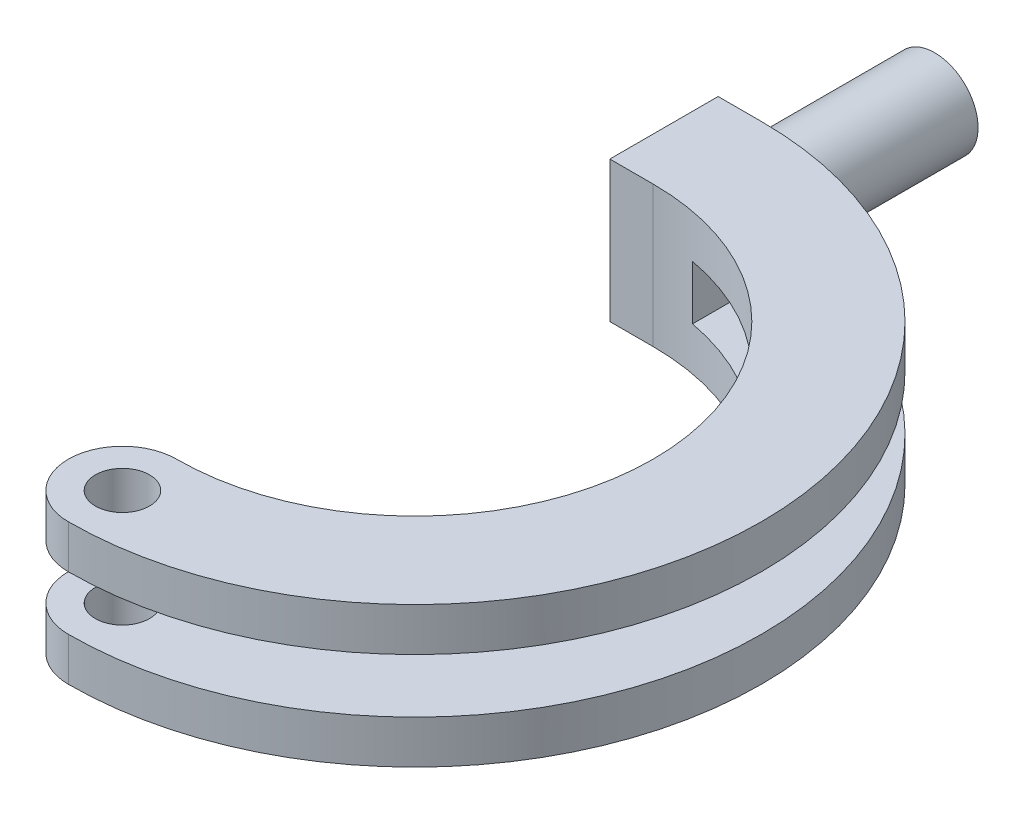
ISO-10303-21;
HEADER;
FILE_DESCRIPTION(('STEP AP214'),'2;1');
FILE_NAME('part.step','',(''),(''),'','','');
FILE_SCHEMA(('AUTOMOTIVE_DESIGN { 1 0 10303 214 1 1 1 1 }'));
ENDSEC;
DATA;
#1=APPLICATION_CONTEXT('core data for automotive mechanical design processes');
#2=APPLICATION_PROTOCOL_DEFINITION('international standard','automotive_design',2000,#1);
#3=PRODUCT_CONTEXT('',#1,'mechanical');
#4=PRODUCT('Part','Part','',(#3));
#5=PRODUCT_RELATED_PRODUCT_CATEGORY('part','',(#4));
#6=PRODUCT_DEFINITION_FORMATION('','',#4);
#7=PRODUCT_DEFINITION_CONTEXT('part definition',#1,'design');
#8=PRODUCT_DEFINITION('design','',#6,#7);
#9=PRODUCT_DEFINITION_SHAPE('','',#8);
#10=(LENGTH_UNIT() NAMED_UNIT(*) SI_UNIT(.MILLI.,.METRE.));
#11=(NAMED_UNIT(*) PLANE_ANGLE_UNIT() SI_UNIT($,.RADIAN.));
#12=(NAMED_UNIT(*) SI_UNIT($,.STERADIAN.) SOLID_ANGLE_UNIT());
#13=UNCERTAINTY_MEASURE_WITH_UNIT(LENGTH_MEASURE(1.E-05),#10,'distance_accuracy_value','');
#14=(GEOMETRIC_REPRESENTATION_CONTEXT(3) GLOBAL_UNCERTAINTY_ASSIGNED_CONTEXT((#13)) GLOBAL_UNIT_ASSIGNED_CONTEXT((#10,
#11,#12)) REPRESENTATION_CONTEXT('',''));
#15=CARTESIAN_POINT('',(0.,0.,0.));
#16=DIRECTION('',(0.,0.,1.));
#17=DIRECTION('',(1.,0.,0.));
#18=AXIS2_PLACEMENT_3D('',#15,#16,#17);
#19=CARTESIAN_POINT('',(-2.,2.,-16.));
#20=DIRECTION('',(0.,0.,1.));
#21=DIRECTION('',(1.,0.,0.));
#22=AXIS2_PLACEMENT_3D('',#19,#20,#21);
#23=PLANE('',#22);
#24=CARTESIAN_POINT('',(0.,3.25,-16.));
#25=DIRECTION('',(0.,0.,-1.));
#26=DIRECTION('',(-1.,0.,0.));
#27=AXIS2_PLACEMENT_3D('',#24,#25,#26);
#28=CIRCLE('',#27,2.);
#29=CARTESIAN_POINT('',(0.,1.25,-16.));
#30=VERTEX_POINT('',#29);
#31=CARTESIAN_POINT('',(-2.,3.25,-16.));
#32=VERTEX_POINT('',#31);
#33=EDGE_CURVE('E55',#30,#32,#28,.T.);
#34=ORIENTED_EDGE('',*,*,#33,.F.);
#35=DIRECTION('',(0.,-1.,0.));
#36=VECTOR('',#35,1.);
#37=CARTESIAN_POINT('',(0.,2.,-16.));
#38=LINE('',#37,#36);
#39=CARTESIAN_POINT('',(0.,0.,-16.));
#40=VERTEX_POINT('',#39);
#41=EDGE_CURVE('E133',#30,#40,#38,.T.);
#42=ORIENTED_EDGE('',*,*,#41,.T.);
#43=DIRECTION('',(-1.,0.,0.));
#44=VECTOR('',#43,1.);
#45=CARTESIAN_POINT('',(-2.,0.,-16.));
#46=LINE('',#45,#44);
#47=CARTESIAN_POINT('',(-2.,0.,-16.));
#48=VERTEX_POINT('',#47);
#49=EDGE_CURVE('E248',#40,#48,#46,.T.);
#50=ORIENTED_EDGE('',*,*,#49,.T.);
#51=DIRECTION('',(0.,-1.,0.));
#52=VECTOR('',#51,1.);
#53=CARTESIAN_POINT('',(-2.,2.,-16.));
#54=LINE('',#53,#52);
#55=EDGE_CURVE('E264',#32,#48,#54,.T.);
#56=ORIENTED_EDGE('',*,*,#55,.F.);
#57=EDGE_LOOP('',(#34,#42,#50,#56));
#58=FACE_BOUND('',#57,.T.);
#59=ADVANCED_FACE('F39',(#58),#23,.F.);
#60=CARTESIAN_POINT('',(0.,2.,0.));
#61=DIRECTION('',(0.,1.,0.));
#62=DIRECTION('',(0.,0.,1.));
#63=AXIS2_PLACEMENT_3D('',#60,#61,#62);
#64=PLANE('',#63);
#65=DIRECTION('',(0.,0.,-1.));
#66=VECTOR('',#65,1.);
#67=CARTESIAN_POINT('',(2.,2.,-10.816653826392));
#68=LINE('',#67,#66);
#69=CARTESIAN_POINT('',(2.,2.,-10.816653826392));
#70=VERTEX_POINT('',#69);
#71=CARTESIAN_POINT('',(2.,2.,-15.8745078663875));
#72=VERTEX_POINT('',#71);
#73=EDGE_CURVE('E204',#70,#72,#68,.T.);
#74=ORIENTED_EDGE('',*,*,#73,.F.);
#75=CARTESIAN_POINT('',(0.,2.,0.));
#76=DIRECTION('',(0.,-1.,0.));
#77=DIRECTION('',(0.,0.,1.));
#78=AXIS2_PLACEMENT_3D('',#75,#76,#77);
#79=CIRCLE('',#78,11.);
#80=CARTESIAN_POINT('',(0.,2.,11.));
#81=VERTEX_POINT('',#80);
#82=EDGE_CURVE('E228',#70,#81,#79,.T.);
#83=ORIENTED_EDGE('',*,*,#82,.T.);
#84=CARTESIAN_POINT('',(0.,2.,13.5));
#85=DIRECTION('',(0.,1.,0.));
#86=DIRECTION('',(0.,0.,1.));
#87=AXIS2_PLACEMENT_3D('',#84,#85,#86);
#88=CIRCLE('',#87,2.5);
#89=CARTESIAN_POINT('',(0.,2.,16.));
#90=VERTEX_POINT('',#89);
#91=EDGE_CURVE('E231',#81,#90,#88,.T.);
#92=ORIENTED_EDGE('',*,*,#91,.T.);
#93=CARTESIAN_POINT('',(0.,2.,0.));
#94=DIRECTION('',(0.,1.,0.));
#95=DIRECTION('',(0.,0.,1.));
#96=AXIS2_PLACEMENT_3D('',#93,#94,#95);
#97=CIRCLE('',#96,16.);
#98=EDGE_CURVE('E235',#90,#72,#97,.T.);
#99=ORIENTED_EDGE('',*,*,#98,.T.);
#100=EDGE_LOOP('',(#74,#83,#92,#99));
#101=FACE_BOUND('',#100,.T.);
#102=CARTESIAN_POINT('',(0.,2.,13.5));
#103=DIRECTION('',(0.,1.,0.));
#104=DIRECTION('',(0.,0.,1.));
#105=AXIS2_PLACEMENT_3D('',#102,#103,#104);
#106=CIRCLE('',#105,1.25);
#107=CARTESIAN_POINT('',(0.,2.,14.75));
#108=VERTEX_POINT('',#107);
#109=EDGE_CURVE('E220',#108,#108,#106,.T.);
#110=ORIENTED_EDGE('',*,*,#109,.F.);
#111=EDGE_LOOP('',(#110));
#112=FACE_BOUND('',#111,.T.);
#113=ADVANCED_FACE('F306',(#101,#112),#64,.T.);
#114=CARTESIAN_POINT('',(0.,0.,0.));
#115=DIRECTION('',(0.,1.,0.));
#116=DIRECTION('',(0.,0.,1.));
#117=AXIS2_PLACEMENT_3D('',#114,#115,#116);
#118=PLANE('',#117);
#119=CARTESIAN_POINT('',(0.,0.,0.));
#120=DIRECTION('',(0.,-1.,0.));
#121=DIRECTION('',(0.,0.,1.));
#122=AXIS2_PLACEMENT_3D('',#119,#120,#121);
#123=CIRCLE('',#122,11.);
#124=CARTESIAN_POINT('',(0.,0.,-11.));
#125=VERTEX_POINT('',#124);
#126=CARTESIAN_POINT('',(0.,0.,11.));
#127=VERTEX_POINT('',#126);
#128=EDGE_CURVE('E224',#125,#127,#123,.T.);
#129=ORIENTED_EDGE('',*,*,#128,.F.);
#130=DIRECTION('',(1.,0.,0.));
#131=VECTOR('',#130,1.);
#132=CARTESIAN_POINT('',(0.,0.,-11.));
#133=LINE('',#132,#131);
#134=CARTESIAN_POINT('',(-2.,0.,-11.));
#135=VERTEX_POINT('',#134);
#136=EDGE_CURVE('E232',#135,#125,#133,.T.);
#137=ORIENTED_EDGE('',*,*,#136,.F.);
#138=DIRECTION('',(0.,0.,1.));
#139=VECTOR('',#138,1.);
#140=CARTESIAN_POINT('',(-2.,0.,-11.));
#141=LINE('',#140,#139);
#142=EDGE_CURVE('E252',#48,#135,#141,.T.);
#143=ORIENTED_EDGE('',*,*,#142,.F.);
#144=ORIENTED_EDGE('',*,*,#49,.F.);
#145=CARTESIAN_POINT('',(0.,0.,0.));
#146=DIRECTION('',(0.,1.,0.));
#147=DIRECTION('',(0.,0.,1.));
#148=AXIS2_PLACEMENT_3D('',#145,#146,#147);
#149=CIRCLE('',#148,16.);
#150=CARTESIAN_POINT('',(0.,0.,16.));
#151=VERTEX_POINT('',#150);
#152=EDGE_CURVE('E245',#151,#40,#149,.T.);
#153=ORIENTED_EDGE('',*,*,#152,.F.);
#154=CARTESIAN_POINT('',(0.,0.,13.5));
#155=DIRECTION('',(0.,1.,0.));
#156=DIRECTION('',(0.,0.,1.));
#157=AXIS2_PLACEMENT_3D('',#154,#155,#156);
#158=CIRCLE('',#157,2.5);
#159=EDGE_CURVE('E242',#127,#151,#158,.T.);
#160=ORIENTED_EDGE('',*,*,#159,.F.);
#161=EDGE_LOOP('',(#129,#137,#143,#144,#153,#160));
#162=FACE_BOUND('',#161,.T.);
#163=CARTESIAN_POINT('',(0.,0.,13.5));
#164=DIRECTION('',(0.,1.,0.));
#165=DIRECTION('',(0.,0.,1.));
#166=AXIS2_PLACEMENT_3D('',#163,#164,#165);
#167=CIRCLE('',#166,1.25);
#168=CARTESIAN_POINT('',(0.,0.,14.75));
#169=VERTEX_POINT('',#168);
#170=EDGE_CURVE('E213',#169,#169,#167,.T.);
#171=ORIENTED_EDGE('',*,*,#170,.T.);
#172=EDGE_LOOP('',(#171));
#173=FACE_BOUND('',#172,.T.);
#174=ADVANCED_FACE('F278',(#162,#173),#118,.F.);
#175=CARTESIAN_POINT('',(0.,2.,0.));
#176=DIRECTION('',(0.,-1.,0.));
#177=DIRECTION('',(0.,0.,-1.));
#178=AXIS2_PLACEMENT_3D('',#175,#176,#177);
#179=CYLINDRICAL_SURFACE('',#178,11.);
#180=ORIENTED_EDGE('',*,*,#128,.T.);
#181=DIRECTION('',(0.,-1.,0.));
#182=VECTOR('',#181,1.);
#183=CARTESIAN_POINT('',(0.,2.,11.));
#184=LINE('',#183,#182);
#185=EDGE_CURVE('E11',#81,#127,#184,.T.);
#186=ORIENTED_EDGE('',*,*,#185,.F.);
#187=ORIENTED_EDGE('',*,*,#82,.F.);
#188=DIRECTION('',(0.,-1.,0.));
#189=VECTOR('',#188,1.);
#190=CARTESIAN_POINT('',(2.,11.0472954382292,-10.816653826392));
#191=LINE('',#190,#189);
#192=CARTESIAN_POINT('',(2.,4.5,-10.816653826392));
#193=VERTEX_POINT('',#192);
#194=EDGE_CURVE('E203',#193,#70,#191,.T.);
#195=ORIENTED_EDGE('',*,*,#194,.F.);
#196=CARTESIAN_POINT('',(0.,4.5,0.));
#197=DIRECTION('',(0.,-1.,0.));
#198=DIRECTION('',(0.,0.,1.));
#199=AXIS2_PLACEMENT_3D('',#196,#197,#198);
#200=CIRCLE('',#199,11.);
#201=CARTESIAN_POINT('',(0.,4.5,11.));
#202=VERTEX_POINT('',#201);
#203=EDGE_CURVE('E162',#193,#202,#200,.T.);
#204=ORIENTED_EDGE('',*,*,#203,.T.);
#205=DIRECTION('',(0.,-1.,0.));
#206=VECTOR('',#205,1.);
#207=CARTESIAN_POINT('',(0.,6.5,11.));
#208=LINE('',#207,#206);
#209=CARTESIAN_POINT('',(0.,6.5,11.));
#210=VERTEX_POINT('',#209);
#211=EDGE_CURVE('E199',#210,#202,#208,.T.);
#212=ORIENTED_EDGE('',*,*,#211,.F.);
#213=CARTESIAN_POINT('',(0.,6.5,0.));
#214=DIRECTION('',(0.,-1.,0.));
#215=DIRECTION('',(0.,0.,1.));
#216=AXIS2_PLACEMENT_3D('',#213,#214,#215);
#217=CIRCLE('',#216,11.);
#218=CARTESIAN_POINT('',(0.,6.5,-11.));
#219=VERTEX_POINT('',#218);
#220=EDGE_CURVE('E166',#219,#210,#217,.T.);
#221=ORIENTED_EDGE('',*,*,#220,.F.);
#222=DIRECTION('',(0.,-1.,0.));
#223=VECTOR('',#222,1.);
#224=CARTESIAN_POINT('',(0.,2.,-11.));
#225=LINE('',#224,#223);
#226=EDGE_CURVE('E238',#219,#125,#225,.T.);
#227=ORIENTED_EDGE('',*,*,#226,.T.);
#228=EDGE_LOOP('',(#180,#186,#187,#195,#204,#212,#221,#227));
#229=FACE_BOUND('',#228,.T.);
#230=ADVANCED_FACE('F41',(#229),#179,.F.);
#231=CARTESIAN_POINT('',(0.,2.,13.5));
#232=DIRECTION('',(0.,-1.,0.));
#233=DIRECTION('',(0.,0.,-1.));
#234=AXIS2_PLACEMENT_3D('',#231,#232,#233);
#235=CYLINDRICAL_SURFACE('',#234,2.5);
#236=ORIENTED_EDGE('',*,*,#159,.T.);
#237=DIRECTION('',(0.,-1.,0.));
#238=VECTOR('',#237,1.);
#239=CARTESIAN_POINT('',(0.,2.,16.));
#240=LINE('',#239,#238);
#241=EDGE_CURVE('E48',#90,#151,#240,.T.);
#242=ORIENTED_EDGE('',*,*,#241,.F.);
#243=ORIENTED_EDGE('',*,*,#91,.F.);
#244=ORIENTED_EDGE('',*,*,#185,.T.);
#245=EDGE_LOOP('',(#236,#242,#243,#244));
#246=FACE_BOUND('',#245,.T.);
#247=ADVANCED_FACE('F308',(#246),#235,.T.);
#248=CARTESIAN_POINT('',(0.,2.,0.));
#249=DIRECTION('',(0.,-1.,0.));
#250=DIRECTION('',(0.,0.,-1.));
#251=AXIS2_PLACEMENT_3D('',#248,#249,#250);
#252=CYLINDRICAL_SURFACE('',#251,16.);
#253=ORIENTED_EDGE('',*,*,#152,.T.);
#254=ORIENTED_EDGE('',*,*,#41,.F.);
#255=DIRECTION('',(0.,-1.,0.));
#256=VECTOR('',#255,1.);
#257=CARTESIAN_POINT('',(0.,2.,-16.));
#258=LINE('',#257,#256);
#259=CARTESIAN_POINT('',(0.,5.25,-16.));
#260=VERTEX_POINT('',#259);
#261=EDGE_CURVE('E136',#260,#30,#258,.T.);
#262=ORIENTED_EDGE('',*,*,#261,.F.);
#263=CARTESIAN_POINT('',(0.,6.5,-16.));
#264=VERTEX_POINT('',#263);
#265=EDGE_CURVE('E124',#264,#260,#38,.T.);
#266=ORIENTED_EDGE('',*,*,#265,.F.);
#267=CARTESIAN_POINT('',(0.,6.5,0.));
#268=DIRECTION('',(0.,1.,0.));
#269=DIRECTION('',(0.,0.,1.));
#270=AXIS2_PLACEMENT_3D('',#267,#268,#269);
#271=CIRCLE('',#270,16.);
#272=CARTESIAN_POINT('',(0.,6.5,16.));
#273=VERTEX_POINT('',#272);
#274=EDGE_CURVE('E174',#273,#264,#271,.T.);
#275=ORIENTED_EDGE('',*,*,#274,.F.);
#276=DIRECTION('',(0.,-1.,0.));
#277=VECTOR('',#276,1.);
#278=CARTESIAN_POINT('',(0.,6.5,16.));
#279=LINE('',#278,#277);
#280=CARTESIAN_POINT('',(0.,4.5,16.));
#281=VERTEX_POINT('',#280);
#282=EDGE_CURVE('E187',#273,#281,#279,.T.);
#283=ORIENTED_EDGE('',*,*,#282,.T.);
#284=CARTESIAN_POINT('',(0.,4.5,0.));
#285=DIRECTION('',(0.,1.,0.));
#286=DIRECTION('',(0.,0.,1.));
#287=AXIS2_PLACEMENT_3D('',#284,#285,#286);
#288=CIRCLE('',#287,16.);
#289=CARTESIAN_POINT('',(2.,4.5,-15.8745078663875));
#290=VERTEX_POINT('',#289);
#291=EDGE_CURVE('E171',#281,#290,#288,.T.);
#292=ORIENTED_EDGE('',*,*,#291,.T.);
#293=DIRECTION('',(0.,-1.,0.));
#294=VECTOR('',#293,1.);
#295=CARTESIAN_POINT('',(2.,11.0472954382292,-15.8745078663875));
#296=LINE('',#295,#294);
#297=EDGE_CURVE('E208',#290,#72,#296,.T.);
#298=ORIENTED_EDGE('',*,*,#297,.T.);
#299=ORIENTED_EDGE('',*,*,#98,.F.);
#300=ORIENTED_EDGE('',*,*,#241,.T.);
#301=EDGE_LOOP('',(#253,#254,#262,#266,#275,#283,#292,#298,#299,#300));
#302=FACE_BOUND('',#301,.T.);
#303=ADVANCED_FACE('F139',(#302),#252,.T.);
#304=EDGE_CURVE('E63',#32,#260,#28,.T.);
#305=ORIENTED_EDGE('',*,*,#304,.F.);
#306=CARTESIAN_POINT('',(-2.,6.5,-16.));
#307=VERTEX_POINT('',#306);
#308=EDGE_CURVE('E265',#307,#32,#54,.T.);
#309=ORIENTED_EDGE('',*,*,#308,.F.);
#310=DIRECTION('',(-1.,0.,0.));
#311=VECTOR('',#310,1.);
#312=CARTESIAN_POINT('',(-2.,6.5,-16.));
#313=LINE('',#312,#311);
#314=EDGE_CURVE('E128',#264,#307,#313,.T.);
#315=ORIENTED_EDGE('',*,*,#314,.F.);
#316=ORIENTED_EDGE('',*,*,#265,.T.);
#317=EDGE_LOOP('',(#305,#309,#315,#316));
#318=FACE_BOUND('',#317,.T.);
#319=ADVANCED_FACE('F126',(#318),#23,.F.);
#320=CARTESIAN_POINT('',(-2.,2.,-11.));
#321=DIRECTION('',(1.,0.,0.));
#322=DIRECTION('',(0.,0.,-1.));
#323=AXIS2_PLACEMENT_3D('',#320,#321,#322);
#324=PLANE('',#323);
#325=ORIENTED_EDGE('',*,*,#142,.T.);
#326=DIRECTION('',(0.,-1.,0.));
#327=VECTOR('',#326,1.);
#328=CARTESIAN_POINT('',(-2.,2.,-11.));
#329=LINE('',#328,#327);
#330=CARTESIAN_POINT('',(-2.,6.5,-11.));
#331=VERTEX_POINT('',#330);
#332=EDGE_CURVE('E260',#331,#135,#329,.T.);
#333=ORIENTED_EDGE('',*,*,#332,.F.);
#334=DIRECTION('',(0.,0.,1.));
#335=VECTOR('',#334,1.);
#336=CARTESIAN_POINT('',(-2.,6.5,-11.));
#337=LINE('',#336,#335);
#338=EDGE_CURVE('E179',#307,#331,#337,.T.);
#339=ORIENTED_EDGE('',*,*,#338,.F.);
#340=ORIENTED_EDGE('',*,*,#308,.T.);
#341=ORIENTED_EDGE('',*,*,#55,.T.);
#342=EDGE_LOOP('',(#325,#333,#339,#340,#341));
#343=FACE_BOUND('',#342,.T.);
#344=ADVANCED_FACE('F285',(#343),#324,.F.);
#345=CARTESIAN_POINT('',(0.,2.,-11.));
#346=DIRECTION('',(0.,0.,-1.));
#347=DIRECTION('',(-1.,0.,0.));
#348=AXIS2_PLACEMENT_3D('',#345,#346,#347);
#349=PLANE('',#348);
#350=ORIENTED_EDGE('',*,*,#136,.T.);
#351=ORIENTED_EDGE('',*,*,#226,.F.);
#352=DIRECTION('',(1.,0.,0.));
#353=VECTOR('',#352,1.);
#354=CARTESIAN_POINT('',(0.,6.5,-11.));
#355=LINE('',#354,#353);
#356=EDGE_CURVE('E183',#331,#219,#355,.T.);
#357=ORIENTED_EDGE('',*,*,#356,.F.);
#358=ORIENTED_EDGE('',*,*,#332,.T.);
#359=EDGE_LOOP('',(#350,#351,#357,#358));
#360=FACE_BOUND('',#359,.T.);
#361=ADVANCED_FACE('F311',(#360),#349,.F.);
#362=CARTESIAN_POINT('',(0.,2.,13.5));
#363=DIRECTION('',(0.,-1.,0.));
#364=DIRECTION('',(0.,0.,-1.));
#365=AXIS2_PLACEMENT_3D('',#362,#363,#364);
#366=CYLINDRICAL_SURFACE('',#365,1.25);
#367=ORIENTED_EDGE('',*,*,#109,.T.);
#368=EDGE_LOOP('',(#367));
#369=FACE_BOUND('',#368,.T.);
#370=ORIENTED_EDGE('',*,*,#170,.F.);
#371=EDGE_LOOP('',(#370));
#372=FACE_BOUND('',#371,.T.);
#373=ADVANCED_FACE('F353',(#369,#372),#366,.F.);
#374=CARTESIAN_POINT('',(2.,11.0472954382292,-10.816653826392));
#375=DIRECTION('',(-1.,0.,0.));
#376=DIRECTION('',(0.,0.,1.));
#377=AXIS2_PLACEMENT_3D('',#374,#375,#376);
#378=PLANE('',#377);
#379=DIRECTION('',(0.,0.,-1.));
#380=VECTOR('',#379,1.);
#381=CARTESIAN_POINT('',(2.,4.5,-10.816653826392));
#382=LINE('',#381,#380);
#383=EDGE_CURVE('E209',#193,#290,#382,.T.);
#384=ORIENTED_EDGE('',*,*,#383,.F.);
#385=ORIENTED_EDGE('',*,*,#194,.T.);
#386=ORIENTED_EDGE('',*,*,#73,.T.);
#387=ORIENTED_EDGE('',*,*,#297,.F.);
#388=EDGE_LOOP('',(#384,#385,#386,#387));
#389=FACE_BOUND('',#388,.T.);
#390=ADVANCED_FACE('F300',(#389),#378,.F.);
#391=CARTESIAN_POINT('',(0.,4.5,0.));
#392=DIRECTION('',(0.,1.,0.));
#393=DIRECTION('',(0.,0.,1.));
#394=AXIS2_PLACEMENT_3D('',#391,#392,#393);
#395=PLANE('',#394);
#396=CARTESIAN_POINT('',(0.,4.5,13.5));
#397=DIRECTION('',(0.,1.,0.));
#398=DIRECTION('',(0.,0.,1.));
#399=AXIS2_PLACEMENT_3D('',#396,#397,#398);
#400=CIRCLE('',#399,1.25);
#401=CARTESIAN_POINT('',(0.,4.5,14.75));
#402=VERTEX_POINT('',#401);
#403=EDGE_CURVE('E143',#402,#402,#400,.T.);
#404=ORIENTED_EDGE('',*,*,#403,.T.);
#405=EDGE_LOOP('',(#404));
#406=FACE_BOUND('',#405,.T.);
#407=ORIENTED_EDGE('',*,*,#203,.F.);
#408=ORIENTED_EDGE('',*,*,#383,.T.);
#409=ORIENTED_EDGE('',*,*,#291,.F.);
#410=CARTESIAN_POINT('',(0.,4.5,13.5));
#411=DIRECTION('',(0.,1.,0.));
#412=DIRECTION('',(0.,0.,1.));
#413=AXIS2_PLACEMENT_3D('',#410,#411,#412);
#414=CIRCLE('',#413,2.5);
#415=EDGE_CURVE('E190',#202,#281,#414,.T.);
#416=ORIENTED_EDGE('',*,*,#415,.F.);
#417=EDGE_LOOP('',(#407,#408,#409,#416));
#418=FACE_BOUND('',#417,.T.);
#419=ADVANCED_FACE('F297',(#406,#418),#395,.F.);
#420=CARTESIAN_POINT('',(0.,6.5,0.));
#421=DIRECTION('',(0.,1.,0.));
#422=DIRECTION('',(0.,0.,1.));
#423=AXIS2_PLACEMENT_3D('',#420,#421,#422);
#424=PLANE('',#423);
#425=ORIENTED_EDGE('',*,*,#220,.T.);
#426=CARTESIAN_POINT('',(0.,6.5,13.5));
#427=DIRECTION('',(0.,1.,0.));
#428=DIRECTION('',(0.,0.,1.));
#429=AXIS2_PLACEMENT_3D('',#426,#427,#428);
#430=CIRCLE('',#429,2.5);
#431=EDGE_CURVE('E170',#210,#273,#430,.T.);
#432=ORIENTED_EDGE('',*,*,#431,.T.);
#433=ORIENTED_EDGE('',*,*,#274,.T.);
#434=ORIENTED_EDGE('',*,*,#314,.T.);
#435=ORIENTED_EDGE('',*,*,#338,.T.);
#436=ORIENTED_EDGE('',*,*,#356,.T.);
#437=EDGE_LOOP('',(#425,#432,#433,#434,#435,#436));
#438=FACE_BOUND('',#437,.T.);
#439=CARTESIAN_POINT('',(0.,6.5,13.5));
#440=DIRECTION('',(0.,1.,0.));
#441=DIRECTION('',(0.,0.,1.));
#442=AXIS2_PLACEMENT_3D('',#439,#440,#441);
#443=CIRCLE('',#442,1.25);
#444=CARTESIAN_POINT('',(0.,6.5,14.75));
#445=VERTEX_POINT('',#444);
#446=EDGE_CURVE('E158',#445,#445,#443,.T.);
#447=ORIENTED_EDGE('',*,*,#446,.F.);
#448=EDGE_LOOP('',(#447));
#449=FACE_BOUND('',#448,.T.);
#450=ADVANCED_FACE('F288',(#438,#449),#424,.T.);
#451=CARTESIAN_POINT('',(0.,6.5,13.5));
#452=DIRECTION('',(0.,-1.,0.));
#453=DIRECTION('',(0.,0.,-1.));
#454=AXIS2_PLACEMENT_3D('',#451,#452,#453);
#455=CYLINDRICAL_SURFACE('',#454,2.5);
#456=ORIENTED_EDGE('',*,*,#415,.T.);
#457=ORIENTED_EDGE('',*,*,#282,.F.);
#458=ORIENTED_EDGE('',*,*,#431,.F.);
#459=ORIENTED_EDGE('',*,*,#211,.T.);
#460=EDGE_LOOP('',(#456,#457,#458,#459));
#461=FACE_BOUND('',#460,.T.);
#462=ADVANCED_FACE('F312',(#461),#455,.T.);
#463=CARTESIAN_POINT('',(0.,6.5,13.5));
#464=DIRECTION('',(0.,-1.,0.));
#465=DIRECTION('',(0.,0.,-1.));
#466=AXIS2_PLACEMENT_3D('',#463,#464,#465);
#467=CYLINDRICAL_SURFACE('',#466,1.25);
#468=ORIENTED_EDGE('',*,*,#446,.T.);
#469=EDGE_LOOP('',(#468));
#470=FACE_BOUND('',#469,.T.);
#471=ORIENTED_EDGE('',*,*,#403,.F.);
#472=EDGE_LOOP('',(#471));
#473=FACE_BOUND('',#472,.T.);
#474=ADVANCED_FACE('F314',(#470,#473),#467,.F.);
#475=CARTESIAN_POINT('',(0.,3.25,-16.));
#476=DIRECTION('',(0.,0.,-1.));
#477=DIRECTION('',(-1.,0.,0.));
#478=AXIS2_PLACEMENT_3D('',#475,#476,#477);
#479=PLANE('',#478);
#480=EDGE_CURVE('E146',#260,#30,#28,.T.);
#481=ORIENTED_EDGE('',*,*,#480,.F.);
#482=ORIENTED_EDGE('',*,*,#261,.T.);
#483=EDGE_LOOP('',(#481,#482));
#484=FACE_BOUND('',#483,.T.);
#485=ADVANCED_FACE('F147',(#484),#479,.F.);
#486=CARTESIAN_POINT('',(0.,3.25,-24.));
#487=DIRECTION('',(0.,0.,1.));
#488=DIRECTION('',(1.,0.,0.));
#489=AXIS2_PLACEMENT_3D('',#486,#487,#488);
#490=CYLINDRICAL_SURFACE('',#489,2.);
#491=CARTESIAN_POINT('',(0.,3.25,-24.));
#492=DIRECTION('',(0.,0.,-1.));
#493=DIRECTION('',(-1.,0.,0.));
#494=AXIS2_PLACEMENT_3D('',#491,#492,#493);
#495=CIRCLE('',#494,2.);
#496=CARTESIAN_POINT('',(-2.,3.25,-24.));
#497=VERTEX_POINT('',#496);
#498=EDGE_CURVE('E144',#497,#497,#495,.T.);
#499=ORIENTED_EDGE('',*,*,#498,.F.);
#500=EDGE_LOOP('',(#499));
#501=FACE_BOUND('',#500,.T.);
#502=ORIENTED_EDGE('',*,*,#304,.T.);
#503=ORIENTED_EDGE('',*,*,#480,.T.);
#504=ORIENTED_EDGE('',*,*,#33,.T.);
#505=EDGE_LOOP('',(#502,#503,#504));
#506=FACE_BOUND('',#505,.T.);
#507=ADVANCED_FACE('F151',(#501,#506),#490,.T.);
#508=CARTESIAN_POINT('',(0.,3.25,-24.));
#509=DIRECTION('',(0.,0.,-1.));
#510=DIRECTION('',(-1.,0.,0.));
#511=AXIS2_PLACEMENT_3D('',#508,#509,#510);
#512=PLANE('',#511);
#513=ORIENTED_EDGE('',*,*,#498,.T.);
#514=EDGE_LOOP('',(#513));
#515=FACE_BOUND('',#514,.T.);
#516=ADVANCED_FACE('F373',(#515),#512,.T.);
#517=CLOSED_SHELL('',(#59,#113,#174,#230,#247,#303,#319,#344,#361,#373,#390,#419,#450,#462,#474,
#485,#507,#516));
#518=MANIFOLD_SOLID_BREP('B2',#517);
#519=ADVANCED_BREP_SHAPE_REPRESENTATION('',(#18,#518),#14);
#520=SHAPE_DEFINITION_REPRESENTATION(#9,#519);
ENDSEC;
END-ISO-10303-21;
